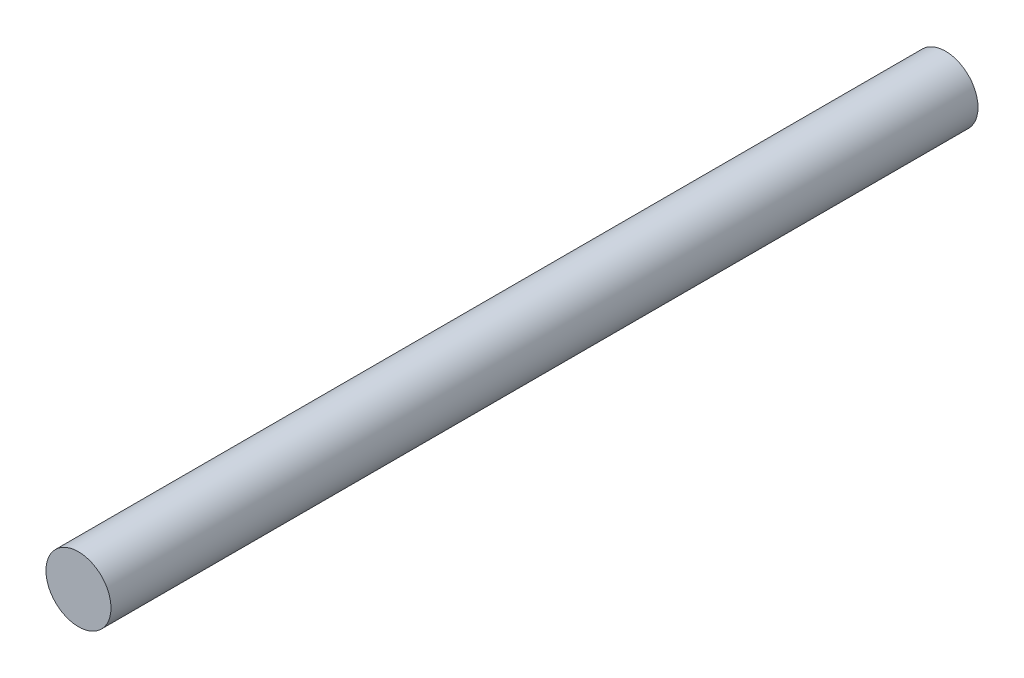
ISO-10303-21;
HEADER;
FILE_DESCRIPTION(('STEP AP214'),'2;1');
FILE_NAME('part.step','',(''),(''),'','','');
FILE_SCHEMA(('AUTOMOTIVE_DESIGN { 1 0 10303 214 1 1 1 1 }'));
ENDSEC;
DATA;
#1=APPLICATION_CONTEXT('core data for automotive mechanical design processes');
#2=APPLICATION_PROTOCOL_DEFINITION('international standard','automotive_design',2000,#1);
#3=PRODUCT_CONTEXT('',#1,'mechanical');
#4=PRODUCT('Part','Part','',(#3));
#5=PRODUCT_RELATED_PRODUCT_CATEGORY('part','',(#4));
#6=PRODUCT_DEFINITION_FORMATION('','',#4);
#7=PRODUCT_DEFINITION_CONTEXT('part definition',#1,'design');
#8=PRODUCT_DEFINITION('design','',#6,#7);
#9=PRODUCT_DEFINITION_SHAPE('','',#8);
#10=(LENGTH_UNIT() NAMED_UNIT(*) SI_UNIT(.MILLI.,.METRE.));
#11=(NAMED_UNIT(*) PLANE_ANGLE_UNIT() SI_UNIT($,.RADIAN.));
#12=(NAMED_UNIT(*) SI_UNIT($,.STERADIAN.) SOLID_ANGLE_UNIT());
#13=UNCERTAINTY_MEASURE_WITH_UNIT(LENGTH_MEASURE(1.E-05),#10,'distance_accuracy_value','');
#14=(GEOMETRIC_REPRESENTATION_CONTEXT(3) GLOBAL_UNCERTAINTY_ASSIGNED_CONTEXT((#13)) GLOBAL_UNIT_ASSIGNED_CONTEXT((#10,
#11,#12)) REPRESENTATION_CONTEXT('',''));
#15=CARTESIAN_POINT('',(0.,0.,0.));
#16=DIRECTION('',(0.,0.,1.));
#17=DIRECTION('',(1.,0.,0.));
#18=AXIS2_PLACEMENT_3D('',#15,#16,#17);
#19=CARTESIAN_POINT('',(0.,0.,80.));
#20=DIRECTION('',(0.,0.,-1.));
#21=DIRECTION('',(-1.,0.,0.));
#22=AXIS2_PLACEMENT_3D('',#19,#20,#21);
#23=CYLINDRICAL_SURFACE('',#22,3.);
#24=CARTESIAN_POINT('',(0.,0.,80.));
#25=DIRECTION('',(0.,0.,1.));
#26=DIRECTION('',(1.,0.,0.));
#27=AXIS2_PLACEMENT_3D('',#24,#25,#26);
#28=CIRCLE('',#27,3.);
#29=CARTESIAN_POINT('',(3.,0.,80.));
#30=VERTEX_POINT('',#29);
#31=EDGE_CURVE('E10',#30,#30,#28,.T.);
#32=ORIENTED_EDGE('',*,*,#31,.F.);
#33=EDGE_LOOP('',(#32));
#34=FACE_BOUND('',#33,.T.);
#35=CARTESIAN_POINT('',(0.,0.,0.));
#36=DIRECTION('',(0.,0.,1.));
#37=DIRECTION('',(1.,0.,0.));
#38=AXIS2_PLACEMENT_3D('',#35,#36,#37);
#39=CIRCLE('',#38,3.);
#40=CARTESIAN_POINT('',(3.,0.,0.));
#41=VERTEX_POINT('',#40);
#42=EDGE_CURVE('E35',#41,#41,#39,.T.);
#43=ORIENTED_EDGE('',*,*,#42,.T.);
#44=EDGE_LOOP('',(#43));
#45=FACE_BOUND('',#44,.T.);
#46=ADVANCED_FACE('F32',(#34,#45),#23,.T.);
#47=CARTESIAN_POINT('',(0.,0.,80.));
#48=DIRECTION('',(0.,0.,1.));
#49=DIRECTION('',(1.,0.,0.));
#50=AXIS2_PLACEMENT_3D('',#47,#48,#49);
#51=PLANE('',#50);
#52=ORIENTED_EDGE('',*,*,#31,.T.);
#53=EDGE_LOOP('',(#52));
#54=FACE_BOUND('',#53,.T.);
#55=ADVANCED_FACE('F47',(#54),#51,.T.);
#56=CARTESIAN_POINT('',(0.,0.,0.));
#57=DIRECTION('',(0.,0.,1.));
#58=DIRECTION('',(1.,0.,0.));
#59=AXIS2_PLACEMENT_3D('',#56,#57,#58);
#60=PLANE('',#59);
#61=ORIENTED_EDGE('',*,*,#42,.F.);
#62=EDGE_LOOP('',(#61));
#63=FACE_BOUND('',#62,.T.);
#64=ADVANCED_FACE('F45',(#63),#60,.F.);
#65=CLOSED_SHELL('',(#46,#55,#64));
#66=MANIFOLD_SOLID_BREP('B2',#65);
#67=ADVANCED_BREP_SHAPE_REPRESENTATION('',(#18,#66),#14);
#68=SHAPE_DEFINITION_REPRESENTATION(#9,#67);
ENDSEC;
END-ISO-10303-21;
